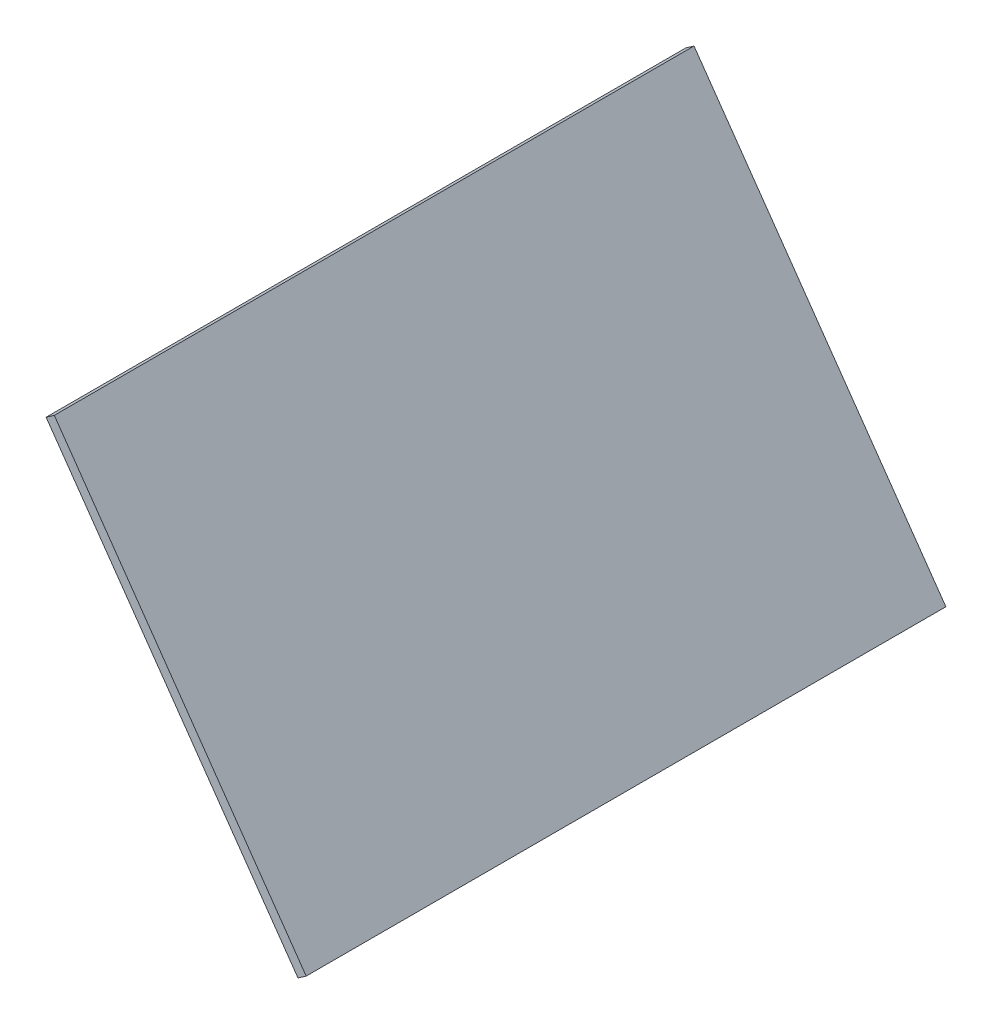
ISO-10303-21;
HEADER;
FILE_DESCRIPTION(('STEP AP214'),'2;1');
FILE_NAME('part.step','',(''),(''),'','','');
FILE_SCHEMA(('AUTOMOTIVE_DESIGN { 1 0 10303 214 1 1 1 1 }'));
ENDSEC;
DATA;
#1=APPLICATION_CONTEXT('core data for automotive mechanical design processes');
#2=APPLICATION_PROTOCOL_DEFINITION('international standard','automotive_design',2000,#1);
#3=PRODUCT_CONTEXT('',#1,'mechanical');
#4=PRODUCT('Part','Part','',(#3));
#5=PRODUCT_RELATED_PRODUCT_CATEGORY('part','',(#4));
#6=PRODUCT_DEFINITION_FORMATION('','',#4);
#7=PRODUCT_DEFINITION_CONTEXT('part definition',#1,'design');
#8=PRODUCT_DEFINITION('design','',#6,#7);
#9=PRODUCT_DEFINITION_SHAPE('','',#8);
#10=(LENGTH_UNIT() NAMED_UNIT(*) SI_UNIT(.MILLI.,.METRE.));
#11=(NAMED_UNIT(*) PLANE_ANGLE_UNIT() SI_UNIT($,.RADIAN.));
#12=(NAMED_UNIT(*) SI_UNIT($,.STERADIAN.) SOLID_ANGLE_UNIT());
#13=UNCERTAINTY_MEASURE_WITH_UNIT(LENGTH_MEASURE(1.E-05),#10,'distance_accuracy_value','');
#14=(GEOMETRIC_REPRESENTATION_CONTEXT(3) GLOBAL_UNCERTAINTY_ASSIGNED_CONTEXT((#13)) GLOBAL_UNIT_ASSIGNED_CONTEXT((#10,
#11,#12)) REPRESENTATION_CONTEXT('',''));
#15=CARTESIAN_POINT('',(0.,0.,0.));
#16=DIRECTION('',(0.,0.,1.));
#17=DIRECTION('',(1.,0.,0.));
#18=AXIS2_PLACEMENT_3D('',#15,#16,#17);
#19=CARTESIAN_POINT('',(-50.8,58.0399349939998,101.6));
#20=DIRECTION('',(-0.819152044288993,-0.573576436351044,0.));
#21=DIRECTION('',(0.573576436351044,-0.819152044288993,0.));
#22=AXIS2_PLACEMENT_3D('',#19,#20,#21);
#23=PLANE('',#22);
#24=DIRECTION('',(-0.573576436351044,0.819152044288993,0.));
#25=VECTOR('',#24,1.);
#26=CARTESIAN_POINT('',(-50.8,58.0399349939998,0.));
#27=LINE('',#26,#25);
#28=CARTESIAN_POINT('',(-10.7975757893501,0.910552592707279,0.));
#29=VERTEX_POINT('',#28);
#30=CARTESIAN_POINT('',(-50.8,58.0399349939998,0.));
#31=VERTEX_POINT('',#30);
#32=EDGE_CURVE('E96',#29,#31,#27,.T.);
#33=ORIENTED_EDGE('',*,*,#32,.T.);
#34=DIRECTION('',(0.,0.,-1.));
#35=VECTOR('',#34,1.);
#36=CARTESIAN_POINT('',(-50.8,58.0399349939998,101.6));
#37=LINE('',#36,#35);
#38=CARTESIAN_POINT('',(-50.8,58.0399349939998,101.6));
#39=VERTEX_POINT('',#38);
#40=EDGE_CURVE('E11',#39,#31,#37,.T.);
#41=ORIENTED_EDGE('',*,*,#40,.F.);
#42=DIRECTION('',(-0.573576436351044,0.819152044288993,0.));
#43=VECTOR('',#42,1.);
#44=CARTESIAN_POINT('',(-50.8,58.0399349939998,101.6));
#45=LINE('',#44,#43);
#46=CARTESIAN_POINT('',(-10.7975757893501,0.910552592707279,101.6));
#47=VERTEX_POINT('',#46);
#48=EDGE_CURVE('E84',#47,#39,#45,.T.);
#49=ORIENTED_EDGE('',*,*,#48,.F.);
#50=DIRECTION('',(0.,0.,-1.));
#51=VECTOR('',#50,1.);
#52=CARTESIAN_POINT('',(-10.7975757893501,0.910552592707279,101.6));
#53=LINE('',#52,#51);
#54=EDGE_CURVE('E92',#47,#29,#53,.T.);
#55=ORIENTED_EDGE('',*,*,#54,.T.);
#56=EDGE_LOOP('',(#33,#41,#49,#55));
#57=FACE_BOUND('',#56,.T.);
#58=ADVANCED_FACE('F33',(#57),#23,.F.);
#59=CARTESIAN_POINT('',(-50.8,58.0399349939998,101.6));
#60=DIRECTION('',(0.573576436351044,-0.819152044288993,0.));
#61=DIRECTION('',(0.819152044288993,0.573576436351044,0.));
#62=AXIS2_PLACEMENT_3D('',#59,#60,#61);
#63=PLANE('',#62);
#64=DIRECTION('',(-0.819152044288993,-0.573576436351044,0.));
#65=VECTOR('',#64,1.);
#66=CARTESIAN_POINT('',(-50.8,58.0399349939998,0.));
#67=LINE('',#66,#65);
#68=CARTESIAN_POINT('',(-52.1004038703088,57.1293824012925,0.));
#69=VERTEX_POINT('',#68);
#70=EDGE_CURVE('E88',#31,#69,#67,.T.);
#71=ORIENTED_EDGE('',*,*,#70,.T.);
#72=DIRECTION('',(0.,0.,-1.));
#73=VECTOR('',#72,1.);
#74=CARTESIAN_POINT('',(-52.1004038703088,57.1293824012925,101.6));
#75=LINE('',#74,#73);
#76=CARTESIAN_POINT('',(-52.1004038703088,57.1293824012925,101.6));
#77=VERTEX_POINT('',#76);
#78=EDGE_CURVE('E41',#77,#69,#75,.T.);
#79=ORIENTED_EDGE('',*,*,#78,.F.);
#80=DIRECTION('',(-0.819152044288993,-0.573576436351044,0.));
#81=VECTOR('',#80,1.);
#82=CARTESIAN_POINT('',(-50.8,58.0399349939998,101.6));
#83=LINE('',#82,#81);
#84=EDGE_CURVE('E79',#39,#77,#83,.T.);
#85=ORIENTED_EDGE('',*,*,#84,.F.);
#86=ORIENTED_EDGE('',*,*,#40,.T.);
#87=EDGE_LOOP('',(#71,#79,#85,#86));
#88=FACE_BOUND('',#87,.T.);
#89=ADVANCED_FACE('F87',(#88),#63,.F.);
#90=CARTESIAN_POINT('',(-52.1004038703088,57.1293824012925,101.6));
#91=DIRECTION('',(0.819152044288993,0.573576436351044,0.));
#92=DIRECTION('',(-0.573576436351044,0.819152044288993,0.));
#93=AXIS2_PLACEMENT_3D('',#90,#91,#92);
#94=PLANE('',#93);
#95=DIRECTION('',(0.573576436351044,-0.819152044288993,0.));
#96=VECTOR('',#95,1.);
#97=CARTESIAN_POINT('',(-52.1004038703088,57.1293824012925,0.));
#98=LINE('',#97,#96);
#99=CARTESIAN_POINT('',(-12.0979796596588,0.,0.));
#100=VERTEX_POINT('',#99);
#101=EDGE_CURVE('E66',#69,#100,#98,.T.);
#102=ORIENTED_EDGE('',*,*,#101,.T.);
#103=DIRECTION('',(0.,0.,-1.));
#104=VECTOR('',#103,1.);
#105=CARTESIAN_POINT('',(-12.0979796596588,0.,101.6));
#106=LINE('',#105,#104);
#107=CARTESIAN_POINT('',(-12.0979796596588,0.,101.6));
#108=VERTEX_POINT('',#107);
#109=EDGE_CURVE('E89',#108,#100,#106,.T.);
#110=ORIENTED_EDGE('',*,*,#109,.F.);
#111=DIRECTION('',(0.573576436351044,-0.819152044288993,0.));
#112=VECTOR('',#111,1.);
#113=CARTESIAN_POINT('',(-52.1004038703088,57.1293824012925,101.6));
#114=LINE('',#113,#112);
#115=EDGE_CURVE('E82',#77,#108,#114,.T.);
#116=ORIENTED_EDGE('',*,*,#115,.F.);
#117=ORIENTED_EDGE('',*,*,#78,.T.);
#118=EDGE_LOOP('',(#102,#110,#116,#117));
#119=FACE_BOUND('',#118,.T.);
#120=ADVANCED_FACE('F90',(#119),#94,.F.);
#121=CARTESIAN_POINT('',(-10.7975757893501,0.910552592707279,101.6));
#122=DIRECTION('',(-0.573576436351043,0.819152044288994,0.));
#123=DIRECTION('',(-0.819152044288994,-0.573576436351043,0.));
#124=AXIS2_PLACEMENT_3D('',#121,#122,#123);
#125=PLANE('',#124);
#126=DIRECTION('',(0.819152044288994,0.573576436351043,0.));
#127=VECTOR('',#126,1.);
#128=CARTESIAN_POINT('',(-10.7975757893501,0.910552592707279,0.));
#129=LINE('',#128,#127);
#130=EDGE_CURVE('E72',#100,#29,#129,.T.);
#131=ORIENTED_EDGE('',*,*,#130,.T.);
#132=ORIENTED_EDGE('',*,*,#54,.F.);
#133=DIRECTION('',(0.819152044288994,0.573576436351043,0.));
#134=VECTOR('',#133,1.);
#135=CARTESIAN_POINT('',(-10.7975757893501,0.910552592707279,101.6));
#136=LINE('',#135,#134);
#137=EDGE_CURVE('E49',#108,#47,#136,.T.);
#138=ORIENTED_EDGE('',*,*,#137,.F.);
#139=ORIENTED_EDGE('',*,*,#109,.T.);
#140=EDGE_LOOP('',(#131,#132,#138,#139));
#141=FACE_BOUND('',#140,.T.);
#142=ADVANCED_FACE('F103',(#141),#125,.F.);
#143=CARTESIAN_POINT('',(0.,0.,101.6));
#144=DIRECTION('',(0.,0.,-1.));
#145=DIRECTION('',(-1.,0.,0.));
#146=AXIS2_PLACEMENT_3D('',#143,#144,#145);
#147=PLANE('',#146);
#148=ORIENTED_EDGE('',*,*,#48,.T.);
#149=ORIENTED_EDGE('',*,*,#84,.T.);
#150=ORIENTED_EDGE('',*,*,#115,.T.);
#151=ORIENTED_EDGE('',*,*,#137,.T.);
#152=EDGE_LOOP('',(#148,#149,#150,#151));
#153=FACE_BOUND('',#152,.T.);
#154=ADVANCED_FACE('F80',(#153),#147,.F.);
#155=CARTESIAN_POINT('',(0.,0.,0.));
#156=DIRECTION('',(0.,0.,-1.));
#157=DIRECTION('',(-1.,0.,0.));
#158=AXIS2_PLACEMENT_3D('',#155,#156,#157);
#159=PLANE('',#158);
#160=ORIENTED_EDGE('',*,*,#32,.F.);
#161=ORIENTED_EDGE('',*,*,#130,.F.);
#162=ORIENTED_EDGE('',*,*,#101,.F.);
#163=ORIENTED_EDGE('',*,*,#70,.F.);
#164=EDGE_LOOP('',(#160,#161,#162,#163));
#165=FACE_BOUND('',#164,.T.);
#166=ADVANCED_FACE('F106',(#165),#159,.T.);
#167=CLOSED_SHELL('',(#58,#89,#120,#142,#154,#166));
#168=MANIFOLD_SOLID_BREP('B2',#167);
#169=ADVANCED_BREP_SHAPE_REPRESENTATION('',(#18,#168),#14);
#170=SHAPE_DEFINITION_REPRESENTATION(#9,#169);
ENDSEC;
END-ISO-10303-21;
